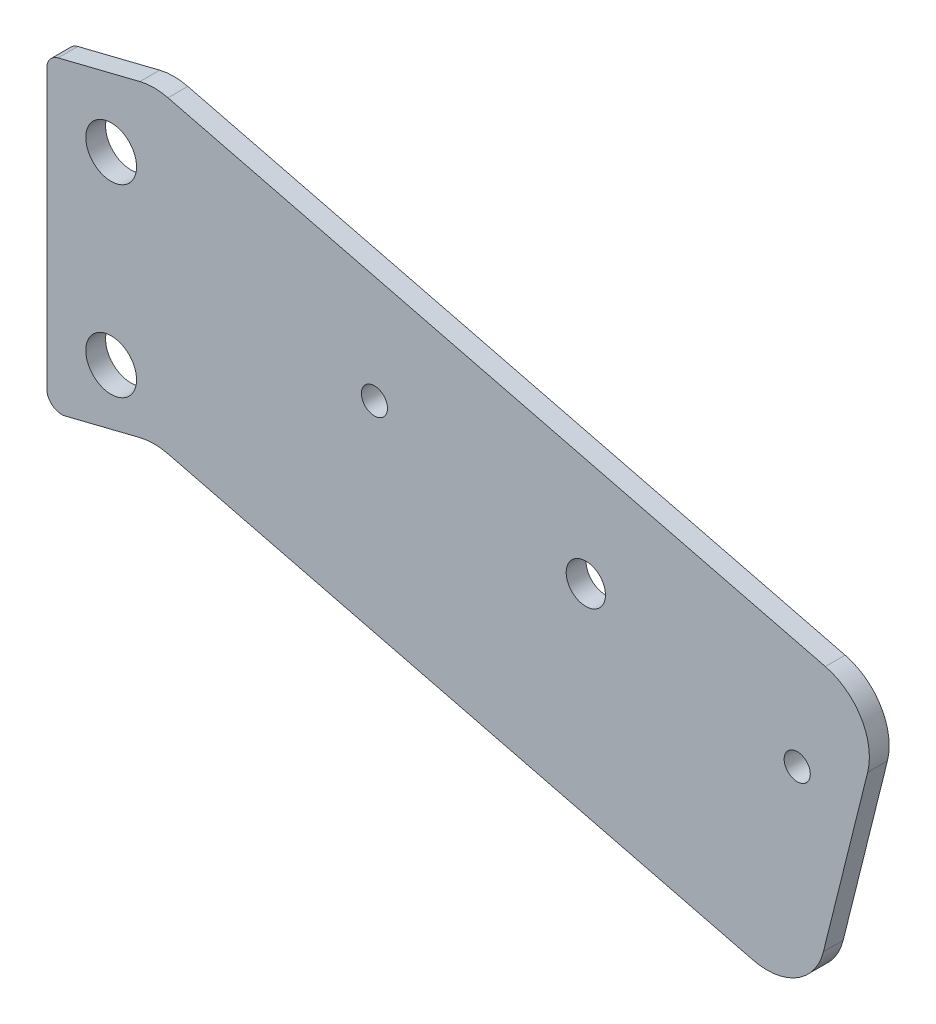
ISO-10303-21;
HEADER;
FILE_DESCRIPTION(('STEP AP214'),'2;1');
FILE_NAME('part.step','',(''),(''),'','','');
FILE_SCHEMA(('AUTOMOTIVE_DESIGN { 1 0 10303 214 1 1 1 1 }'));
ENDSEC;
DATA;
#1=APPLICATION_CONTEXT('core data for automotive mechanical design processes');
#2=APPLICATION_PROTOCOL_DEFINITION('international standard','automotive_design',2000,#1);
#3=PRODUCT_CONTEXT('',#1,'mechanical');
#4=PRODUCT('Part','Part','',(#3));
#5=PRODUCT_RELATED_PRODUCT_CATEGORY('part','',(#4));
#6=PRODUCT_DEFINITION_FORMATION('','',#4);
#7=PRODUCT_DEFINITION_CONTEXT('part definition',#1,'design');
#8=PRODUCT_DEFINITION('design','',#6,#7);
#9=PRODUCT_DEFINITION_SHAPE('','',#8);
#10=(LENGTH_UNIT() NAMED_UNIT(*) SI_UNIT(.MILLI.,.METRE.));
#11=(NAMED_UNIT(*) PLANE_ANGLE_UNIT() SI_UNIT($,.RADIAN.));
#12=(NAMED_UNIT(*) SI_UNIT($,.STERADIAN.) SOLID_ANGLE_UNIT());
#13=UNCERTAINTY_MEASURE_WITH_UNIT(LENGTH_MEASURE(1.E-05),#10,'distance_accuracy_value','');
#14=(GEOMETRIC_REPRESENTATION_CONTEXT(3) GLOBAL_UNCERTAINTY_ASSIGNED_CONTEXT((#13)) GLOBAL_UNIT_ASSIGNED_CONTEXT((#10,
#11,#12)) REPRESENTATION_CONTEXT('',''));
#15=CARTESIAN_POINT('',(0.,0.,0.));
#16=DIRECTION('',(0.,0.,1.));
#17=DIRECTION('',(1.,0.,0.));
#18=AXIS2_PLACEMENT_3D('',#15,#16,#17);
#19=CARTESIAN_POINT('',(-15.8988013968134,-70.6550243550996,-3.4036));
#20=DIRECTION('',(0.,0.,1.));
#21=DIRECTION('',(1.,0.,0.));
#22=AXIS2_PLACEMENT_3D('',#19,#20,#21);
#23=CYLINDRICAL_SURFACE('',#22,2.54);
#24=CARTESIAN_POINT('',(-15.8988013968134,-70.6550243550996,0.));
#25=DIRECTION('',(0.,0.,1.));
#26=DIRECTION('',(-1.,0.,0.));
#27=AXIS2_PLACEMENT_3D('',#24,#25,#26);
#28=CIRCLE('',#27,2.54);
#29=CARTESIAN_POINT('',(-18.4388013968133,-70.6550243550996,0.));
#30=VERTEX_POINT('',#29);
#31=CARTESIAN_POINT('',(-15.2843197819902,-73.1195754998407,0.));
#32=VERTEX_POINT('',#31);
#33=EDGE_CURVE('E159',#30,#32,#28,.T.);
#34=ORIENTED_EDGE('',*,*,#33,.F.);
#35=DIRECTION('',(0.,0.,1.));
#36=VECTOR('',#35,1.);
#37=CARTESIAN_POINT('',(-18.4388013968133,-70.6550243550996,-3.4036));
#38=LINE('',#37,#36);
#39=CARTESIAN_POINT('',(-18.4388013968133,-70.6550243550996,-3.4036));
#40=VERTEX_POINT('',#39);
#41=EDGE_CURVE('E11',#40,#30,#38,.T.);
#42=ORIENTED_EDGE('',*,*,#41,.F.);
#43=CARTESIAN_POINT('',(-15.8988013968134,-70.6550243550996,-3.4036));
#44=DIRECTION('',(0.,0.,1.));
#45=DIRECTION('',(-1.,0.,0.));
#46=AXIS2_PLACEMENT_3D('',#43,#44,#45);
#47=CIRCLE('',#46,2.54);
#48=CARTESIAN_POINT('',(-15.2843197819902,-73.1195754998407,-3.4036));
#49=VERTEX_POINT('',#48);
#50=EDGE_CURVE('E192',#40,#49,#47,.T.);
#51=ORIENTED_EDGE('',*,*,#50,.T.);
#52=DIRECTION('',(0.,0.,1.));
#53=VECTOR('',#52,1.);
#54=CARTESIAN_POINT('',(-15.2843197819902,-73.1195754998407,-3.4036));
#55=LINE('',#54,#53);
#56=EDGE_CURVE('E41',#49,#32,#55,.T.);
#57=ORIENTED_EDGE('',*,*,#56,.T.);
#58=EDGE_LOOP('',(#34,#42,#51,#57));
#59=FACE_BOUND('',#58,.T.);
#60=ADVANCED_FACE('F38',(#59),#23,.T.);
#61=CARTESIAN_POINT('',(-18.4388013968134,-22.8139396806774,-3.4036));
#62=DIRECTION('',(-1.,0.,0.));
#63=DIRECTION('',(0.,-1.,0.));
#64=AXIS2_PLACEMENT_3D('',#61,#62,#63);
#65=PLANE('',#64);
#66=DIRECTION('',(0.,-1.,0.));
#67=VECTOR('',#66,1.);
#68=CARTESIAN_POINT('',(-18.4388013968134,-22.8139396806774,0.));
#69=LINE('',#68,#67);
#70=CARTESIAN_POINT('',(-18.4388013968134,-22.8139396806774,0.));
#71=VERTEX_POINT('',#70);
#72=EDGE_CURVE('E190',#71,#30,#69,.T.);
#73=ORIENTED_EDGE('',*,*,#72,.F.);
#74=DIRECTION('',(0.,0.,1.));
#75=VECTOR('',#74,1.);
#76=CARTESIAN_POINT('',(-18.4388013968134,-22.8139396806774,-3.4036));
#77=LINE('',#76,#75);
#78=CARTESIAN_POINT('',(-18.4388013968134,-22.8139396806774,-3.4036));
#79=VERTEX_POINT('',#78);
#80=EDGE_CURVE('E47',#79,#71,#77,.T.);
#81=ORIENTED_EDGE('',*,*,#80,.F.);
#82=DIRECTION('',(0.,-1.,0.));
#83=VECTOR('',#82,1.);
#84=CARTESIAN_POINT('',(-18.4388013968134,-22.8139396806774,-3.4036));
#85=LINE('',#84,#83);
#86=EDGE_CURVE('E149',#79,#40,#85,.T.);
#87=ORIENTED_EDGE('',*,*,#86,.T.);
#88=ORIENTED_EDGE('',*,*,#41,.T.);
#89=EDGE_LOOP('',(#73,#81,#87,#88));
#90=FACE_BOUND('',#89,.T.);
#91=ADVANCED_FACE('F212',(#90),#65,.T.);
#92=CARTESIAN_POINT('',(-15.8988013968134,-22.8139396806774,-3.4036));
#93=DIRECTION('',(0.,0.,1.));
#94=DIRECTION('',(1.,0.,0.));
#95=AXIS2_PLACEMENT_3D('',#92,#93,#94);
#96=CYLINDRICAL_SURFACE('',#95,2.54);
#97=CARTESIAN_POINT('',(-15.8988013968134,-22.8139396806774,0.));
#98=DIRECTION('',(0.,0.,1.));
#99=DIRECTION('',(1.,0.,0.));
#100=AXIS2_PLACEMENT_3D('',#97,#98,#99);
#101=CIRCLE('',#100,2.54);
#102=CARTESIAN_POINT('',(-16.5132830116365,-20.3493885359364,0.));
#103=VERTEX_POINT('',#102);
#104=EDGE_CURVE('E136',#103,#71,#101,.T.);
#105=ORIENTED_EDGE('',*,*,#104,.F.);
#106=DIRECTION('',(0.,0.,1.));
#107=VECTOR('',#106,1.);
#108=CARTESIAN_POINT('',(-16.5132830116365,-20.3493885359364,-3.4036));
#109=LINE('',#108,#107);
#110=CARTESIAN_POINT('',(-16.5132830116365,-20.3493885359364,-3.4036));
#111=VERTEX_POINT('',#110);
#112=EDGE_CURVE('E131',#111,#103,#109,.T.);
#113=ORIENTED_EDGE('',*,*,#112,.F.);
#114=CARTESIAN_POINT('',(-15.8988013968134,-22.8139396806774,-3.4036));
#115=DIRECTION('',(0.,0.,1.));
#116=DIRECTION('',(1.,0.,0.));
#117=AXIS2_PLACEMENT_3D('',#114,#115,#116);
#118=CIRCLE('',#117,2.54);
#119=EDGE_CURVE('E134',#111,#79,#118,.T.);
#120=ORIENTED_EDGE('',*,*,#119,.T.);
#121=ORIENTED_EDGE('',*,*,#80,.T.);
#122=EDGE_LOOP('',(#105,#113,#120,#121));
#123=FACE_BOUND('',#122,.T.);
#124=ADVANCED_FACE('F133',(#123),#96,.T.);
#125=CARTESIAN_POINT('',(-16.5132830116365,-20.3493885359364,-3.4036));
#126=DIRECTION('',(-0.241921895599666,0.970295726275997,0.));
#127=DIRECTION('',(-0.970295726275997,-0.241921895599666,0.));
#128=AXIS2_PLACEMENT_3D('',#125,#126,#127);
#129=PLANE('',#128);
#130=DIRECTION('',(-0.970295726275997,-0.241921895599666,0.));
#131=VECTOR('',#130,1.);
#132=CARTESIAN_POINT('',(-16.5132830116365,-20.3493885359364,0.));
#133=LINE('',#132,#131);
#134=CARTESIAN_POINT('',(-2.41921895599664,-16.8353436929998,0.));
#135=VERTEX_POINT('',#134);
#136=EDGE_CURVE('E187',#135,#103,#133,.T.);
#137=ORIENTED_EDGE('',*,*,#136,.F.);
#138=DIRECTION('',(0.,0.,1.));
#139=VECTOR('',#138,1.);
#140=CARTESIAN_POINT('',(-2.41921895599664,-16.8353436929998,-3.4036));
#141=LINE('',#140,#139);
#142=CARTESIAN_POINT('',(-2.41921895599664,-16.8353436929998,-3.4036));
#143=VERTEX_POINT('',#142);
#144=EDGE_CURVE('E141',#143,#135,#141,.T.);
#145=ORIENTED_EDGE('',*,*,#144,.F.);
#146=DIRECTION('',(-0.970295726275997,-0.241921895599666,0.));
#147=VECTOR('',#146,1.);
#148=CARTESIAN_POINT('',(-16.5132830116365,-20.3493885359364,-3.4036));
#149=LINE('',#148,#147);
#150=EDGE_CURVE('E147',#143,#111,#149,.T.);
#151=ORIENTED_EDGE('',*,*,#150,.T.);
#152=ORIENTED_EDGE('',*,*,#112,.T.);
#153=EDGE_LOOP('',(#137,#145,#151,#152));
#154=FACE_BOUND('',#153,.T.);
#155=ADVANCED_FACE('F151',(#154),#129,.T.);
#156=CARTESIAN_POINT('',(0.,-26.5383009557598,-3.4036));
#157=DIRECTION('',(0.,0.,1.));
#158=DIRECTION('',(1.,0.,0.));
#159=AXIS2_PLACEMENT_3D('',#156,#157,#158);
#160=CYLINDRICAL_SURFACE('',#159,10.);
#161=CARTESIAN_POINT('',(0.,-26.5383009557598,0.));
#162=DIRECTION('',(0.,0.,1.));
#163=DIRECTION('',(-1.,0.,0.));
#164=AXIS2_PLACEMENT_3D('',#161,#162,#163);
#165=CIRCLE('',#164,10.);
#166=CARTESIAN_POINT('',(2.41921895599665,-16.8353436929998,0.));
#167=VERTEX_POINT('',#166);
#168=EDGE_CURVE('E184',#167,#135,#165,.T.);
#169=ORIENTED_EDGE('',*,*,#168,.F.);
#170=DIRECTION('',(0.,0.,1.));
#171=VECTOR('',#170,1.);
#172=CARTESIAN_POINT('',(2.41921895599665,-16.8353436929998,-3.4036));
#173=LINE('',#172,#171);
#174=CARTESIAN_POINT('',(2.41921895599665,-16.8353436929998,-3.4036));
#175=VERTEX_POINT('',#174);
#176=EDGE_CURVE('E196',#175,#167,#173,.T.);
#177=ORIENTED_EDGE('',*,*,#176,.F.);
#178=CARTESIAN_POINT('',(0.,-26.5383009557598,-3.4036));
#179=DIRECTION('',(0.,0.,1.));
#180=DIRECTION('',(-1.,0.,0.));
#181=AXIS2_PLACEMENT_3D('',#178,#179,#180);
#182=CIRCLE('',#181,10.);
#183=EDGE_CURVE('E152',#175,#143,#182,.T.);
#184=ORIENTED_EDGE('',*,*,#183,.T.);
#185=ORIENTED_EDGE('',*,*,#144,.T.);
#186=EDGE_LOOP('',(#169,#177,#184,#185));
#187=FACE_BOUND('',#186,.T.);
#188=ADVANCED_FACE('F225',(#187),#160,.T.);
#189=CARTESIAN_POINT('',(2.41921895599665,-16.8353436929998,-3.4036));
#190=DIRECTION('',(0.241921895599665,0.970295726275997,0.));
#191=DIRECTION('',(-0.970295726275997,0.241921895599665,0.));
#192=AXIS2_PLACEMENT_3D('',#189,#190,#191);
#193=PLANE('',#192);
#194=DIRECTION('',(-0.970295726275997,0.241921895599665,0.));
#195=VECTOR('',#194,1.);
#196=CARTESIAN_POINT('',(2.41921895599665,-16.8353436929998,0.));
#197=LINE('',#196,#195);
#198=CARTESIAN_POINT('',(115.560967742793,-45.0447499561963,0.));
#199=VERTEX_POINT('',#198);
#200=EDGE_CURVE('E181',#199,#167,#197,.T.);
#201=ORIENTED_EDGE('',*,*,#200,.F.);
#202=DIRECTION('',(0.,0.,1.));
#203=VECTOR('',#202,1.);
#204=CARTESIAN_POINT('',(115.560967742793,-45.0447499561963,-3.4036));
#205=LINE('',#204,#203);
#206=CARTESIAN_POINT('',(115.560967742793,-45.0447499561963,-3.4036));
#207=VERTEX_POINT('',#206);
#208=EDGE_CURVE('E198',#207,#199,#205,.T.);
#209=ORIENTED_EDGE('',*,*,#208,.F.);
#210=DIRECTION('',(-0.970295726275997,0.241921895599665,0.));
#211=VECTOR('',#210,1.);
#212=CARTESIAN_POINT('',(2.41921895599665,-16.8353436929998,-3.4036));
#213=LINE('',#212,#211);
#214=EDGE_CURVE('E154',#207,#175,#213,.T.);
#215=ORIENTED_EDGE('',*,*,#214,.T.);
#216=ORIENTED_EDGE('',*,*,#176,.T.);
#217=EDGE_LOOP('',(#201,#209,#215,#216));
#218=FACE_BOUND('',#217,.T.);
#219=ADVANCED_FACE('F228',(#218),#193,.T.);
#220=CARTESIAN_POINT('',(113.141748786796,-54.7477072189563,-3.4036));
#221=DIRECTION('',(0.,0.,1.));
#222=DIRECTION('',(1.,0.,0.));
#223=AXIS2_PLACEMENT_3D('',#220,#221,#222);
#224=CYLINDRICAL_SURFACE('',#223,10.);
#225=CARTESIAN_POINT('',(113.141748786796,-54.7477072189563,0.));
#226=DIRECTION('',(0.,0.,1.));
#227=DIRECTION('',(-1.,0.,0.));
#228=AXIS2_PLACEMENT_3D('',#225,#226,#227);
#229=CIRCLE('',#228,10.);
#230=CARTESIAN_POINT('',(122.844706049556,-57.1669261749529,0.));
#231=VERTEX_POINT('',#230);
#232=EDGE_CURVE('E178',#231,#199,#229,.T.);
#233=ORIENTED_EDGE('',*,*,#232,.F.);
#234=DIRECTION('',(0.,0.,1.));
#235=VECTOR('',#234,1.);
#236=CARTESIAN_POINT('',(122.844706049556,-57.1669261749529,-3.4036));
#237=LINE('',#236,#235);
#238=CARTESIAN_POINT('',(122.844706049556,-57.1669261749529,-3.4036));
#239=VERTEX_POINT('',#238);
#240=EDGE_CURVE('E200',#239,#231,#237,.T.);
#241=ORIENTED_EDGE('',*,*,#240,.F.);
#242=CARTESIAN_POINT('',(113.141748786796,-54.7477072189563,-3.4036));
#243=DIRECTION('',(0.,0.,1.));
#244=DIRECTION('',(-1.,0.,0.));
#245=AXIS2_PLACEMENT_3D('',#242,#243,#244);
#246=CIRCLE('',#245,10.);
#247=EDGE_CURVE('E332',#239,#207,#246,.T.);
#248=ORIENTED_EDGE('',*,*,#247,.T.);
#249=ORIENTED_EDGE('',*,*,#208,.T.);
#250=EDGE_LOOP('',(#233,#241,#248,#249));
#251=FACE_BOUND('',#250,.T.);
#252=ADVANCED_FACE('F232',(#251),#224,.T.);
#253=CARTESIAN_POINT('',(122.844706049556,-57.1669261749529,-3.4036));
#254=DIRECTION('',(0.970295726275997,-0.241921895599664,0.));
#255=DIRECTION('',(0.241921895599664,0.970295726275997,0.));
#256=AXIS2_PLACEMENT_3D('',#253,#254,#255);
#257=PLANE('',#256);
#258=DIRECTION('',(0.241921895599664,0.970295726275997,0.));
#259=VECTOR('',#258,1.);
#260=CARTESIAN_POINT('',(122.844706049556,-57.1669261749529,0.));
#261=LINE('',#260,#259);
#262=CARTESIAN_POINT('',(115.224166338167,-87.7312415526469,0.));
#263=VERTEX_POINT('',#262);
#264=EDGE_CURVE('E175',#263,#231,#261,.T.);
#265=ORIENTED_EDGE('',*,*,#264,.F.);
#266=DIRECTION('',(0.,0.,1.));
#267=VECTOR('',#266,1.);
#268=CARTESIAN_POINT('',(115.224166338167,-87.7312415526469,-3.4036));
#269=LINE('',#268,#267);
#270=CARTESIAN_POINT('',(115.224166338167,-87.7312415526469,-3.4036));
#271=VERTEX_POINT('',#270);
#272=EDGE_CURVE('E202',#271,#263,#269,.T.);
#273=ORIENTED_EDGE('',*,*,#272,.F.);
#274=DIRECTION('',(0.241921895599664,0.970295726275997,0.));
#275=VECTOR('',#274,1.);
#276=CARTESIAN_POINT('',(122.844706049556,-57.1669261749529,-3.4036));
#277=LINE('',#276,#275);
#278=EDGE_CURVE('E329',#271,#239,#277,.T.);
#279=ORIENTED_EDGE('',*,*,#278,.T.);
#280=ORIENTED_EDGE('',*,*,#240,.T.);
#281=EDGE_LOOP('',(#265,#273,#279,#280));
#282=FACE_BOUND('',#281,.T.);
#283=ADVANCED_FACE('F236',(#282),#257,.T.);
#284=CARTESIAN_POINT('',(105.521209075407,-85.3120225966502,-3.4036));
#285=DIRECTION('',(0.,0.,1.));
#286=DIRECTION('',(1.,0.,0.));
#287=AXIS2_PLACEMENT_3D('',#284,#285,#286);
#288=CYLINDRICAL_SURFACE('',#287,10.);
#289=CARTESIAN_POINT('',(105.521209075407,-85.3120225966502,0.));
#290=DIRECTION('',(0.,0.,1.));
#291=DIRECTION('',(-1.,0.,0.));
#292=AXIS2_PLACEMENT_3D('',#289,#290,#291);
#293=CIRCLE('',#292,10.);
#294=CARTESIAN_POINT('',(103.10199011941,-95.0149798594102,0.));
#295=VERTEX_POINT('',#294);
#296=EDGE_CURVE('E172',#295,#263,#293,.T.);
#297=ORIENTED_EDGE('',*,*,#296,.F.);
#298=DIRECTION('',(0.,0.,1.));
#299=VECTOR('',#298,1.);
#300=CARTESIAN_POINT('',(103.10199011941,-95.0149798594102,-3.4036));
#301=LINE('',#300,#299);
#302=CARTESIAN_POINT('',(103.10199011941,-95.0149798594102,-3.4036));
#303=VERTEX_POINT('',#302);
#304=EDGE_CURVE('E204',#303,#295,#301,.T.);
#305=ORIENTED_EDGE('',*,*,#304,.F.);
#306=CARTESIAN_POINT('',(105.521209075407,-85.3120225966502,-3.4036));
#307=DIRECTION('',(0.,0.,1.));
#308=DIRECTION('',(-1.,0.,0.));
#309=AXIS2_PLACEMENT_3D('',#306,#307,#308);
#310=CIRCLE('',#309,10.);
#311=EDGE_CURVE('E326',#303,#271,#310,.T.);
#312=ORIENTED_EDGE('',*,*,#311,.T.);
#313=ORIENTED_EDGE('',*,*,#272,.T.);
#314=EDGE_LOOP('',(#297,#305,#312,#313));
#315=FACE_BOUND('',#314,.T.);
#316=ADVANCED_FACE('F240',(#315),#288,.T.);
#317=CARTESIAN_POINT('',(103.10199011941,-95.0149798594102,-3.4036));
#318=DIRECTION('',(-0.241921895599665,-0.970295726275997,0.));
#319=DIRECTION('',(0.970295726275997,-0.241921895599665,0.));
#320=AXIS2_PLACEMENT_3D('',#317,#318,#319);
#321=PLANE('',#320);
#322=DIRECTION('',(0.970295726275997,-0.241921895599665,0.));
#323=VECTOR('',#322,1.);
#324=CARTESIAN_POINT('',(103.10199011941,-95.0149798594102,0.));
#325=LINE('',#324,#323);
#326=CARTESIAN_POINT('',(2.41921895599664,-69.9119456045196,0.));
#327=VERTEX_POINT('',#326);
#328=EDGE_CURVE('E169',#327,#295,#325,.T.);
#329=ORIENTED_EDGE('',*,*,#328,.F.);
#330=DIRECTION('',(0.,0.,1.));
#331=VECTOR('',#330,1.);
#332=CARTESIAN_POINT('',(2.41921895599664,-69.9119456045196,-3.4036));
#333=LINE('',#332,#331);
#334=CARTESIAN_POINT('',(2.41921895599664,-69.9119456045196,-3.4036));
#335=VERTEX_POINT('',#334);
#336=EDGE_CURVE('E206',#335,#327,#333,.T.);
#337=ORIENTED_EDGE('',*,*,#336,.F.);
#338=DIRECTION('',(0.970295726275997,-0.241921895599665,0.));
#339=VECTOR('',#338,1.);
#340=CARTESIAN_POINT('',(103.10199011941,-95.0149798594102,-3.4036));
#341=LINE('',#340,#339);
#342=EDGE_CURVE('E323',#335,#303,#341,.T.);
#343=ORIENTED_EDGE('',*,*,#342,.T.);
#344=ORIENTED_EDGE('',*,*,#304,.T.);
#345=EDGE_LOOP('',(#329,#337,#343,#344));
#346=FACE_BOUND('',#345,.T.);
#347=ADVANCED_FACE('F244',(#346),#321,.T.);
#348=CARTESIAN_POINT('',(0.,-79.6149028672795,-3.4036));
#349=DIRECTION('',(0.,0.,1.));
#350=DIRECTION('',(1.,0.,0.));
#351=AXIS2_PLACEMENT_3D('',#348,#349,#350);
#352=CYLINDRICAL_SURFACE('',#351,10.);
#353=CARTESIAN_POINT('',(0.,-79.6149028672795,0.));
#354=DIRECTION('',(0.,0.,-1.));
#355=DIRECTION('',(1.,0.,0.));
#356=AXIS2_PLACEMENT_3D('',#353,#354,#355);
#357=CIRCLE('',#356,10.);
#358=CARTESIAN_POINT('',(-2.41921895599665,-69.9119456045196,0.));
#359=VERTEX_POINT('',#358);
#360=EDGE_CURVE('E166',#359,#327,#357,.T.);
#361=ORIENTED_EDGE('',*,*,#360,.F.);
#362=DIRECTION('',(0.,0.,1.));
#363=VECTOR('',#362,1.);
#364=CARTESIAN_POINT('',(-2.41921895599665,-69.9119456045196,-3.4036));
#365=LINE('',#364,#363);
#366=CARTESIAN_POINT('',(-2.41921895599665,-69.9119456045196,-3.4036));
#367=VERTEX_POINT('',#366);
#368=EDGE_CURVE('E207',#367,#359,#365,.T.);
#369=ORIENTED_EDGE('',*,*,#368,.F.);
#370=CARTESIAN_POINT('',(0.,-79.6149028672795,-3.4036));
#371=DIRECTION('',(0.,0.,-1.));
#372=DIRECTION('',(1.,0.,0.));
#373=AXIS2_PLACEMENT_3D('',#370,#371,#372);
#374=CIRCLE('',#373,10.);
#375=EDGE_CURVE('E320',#367,#335,#374,.T.);
#376=ORIENTED_EDGE('',*,*,#375,.T.);
#377=ORIENTED_EDGE('',*,*,#336,.T.);
#378=EDGE_LOOP('',(#361,#369,#376,#377));
#379=FACE_BOUND('',#378,.T.);
#380=ADVANCED_FACE('F248',(#379),#352,.F.);
#381=CARTESIAN_POINT('',(-2.41921895599665,-69.9119456045196,-3.4036));
#382=DIRECTION('',(0.241921895599665,-0.970295726275997,0.));
#383=DIRECTION('',(0.970295726275997,0.241921895599665,0.));
#384=AXIS2_PLACEMENT_3D('',#381,#382,#383);
#385=PLANE('',#384);
#386=DIRECTION('',(0.970295726275997,0.241921895599665,0.));
#387=VECTOR('',#386,1.);
#388=CARTESIAN_POINT('',(-2.41921895599665,-69.9119456045196,0.));
#389=LINE('',#388,#387);
#390=EDGE_CURVE('E162',#32,#359,#389,.T.);
#391=ORIENTED_EDGE('',*,*,#390,.F.);
#392=ORIENTED_EDGE('',*,*,#56,.F.);
#393=DIRECTION('',(0.970295726275997,0.241921895599665,0.));
#394=VECTOR('',#393,1.);
#395=CARTESIAN_POINT('',(-2.41921895599665,-69.9119456045196,-3.4036));
#396=LINE('',#395,#394);
#397=EDGE_CURVE('E318',#49,#367,#396,.T.);
#398=ORIENTED_EDGE('',*,*,#397,.T.);
#399=ORIENTED_EDGE('',*,*,#368,.T.);
#400=EDGE_LOOP('',(#391,#392,#398,#399));
#401=FACE_BOUND('',#400,.T.);
#402=ADVANCED_FACE('F209',(#401),#385,.T.);
#403=CARTESIAN_POINT('',(-15.8988013968134,-70.6550243550996,-3.4036));
#404=DIRECTION('',(0.,0.,-1.));
#405=DIRECTION('',(-1.,0.,0.));
#406=AXIS2_PLACEMENT_3D('',#403,#404,#405);
#407=PLANE('',#406);
#408=CARTESIAN_POINT('',(-7.36599999999999,-61.5695602345621,-3.4036));
#409=DIRECTION('',(0.,0.,1.));
#410=DIRECTION('',(1.,0.,0.));
#411=AXIS2_PLACEMENT_3D('',#408,#409,#410);
#412=CIRCLE('',#411,4.3688);
#413=CARTESIAN_POINT('',(-2.99719999999999,-61.5695602345621,-3.4036));
#414=VERTEX_POINT('',#413);
#415=EDGE_CURVE('E287',#414,#414,#412,.T.);
#416=ORIENTED_EDGE('',*,*,#415,.T.);
#417=EDGE_LOOP('',(#416));
#418=FACE_BOUND('',#417,.T.);
#419=CARTESIAN_POINT('',(-7.366,-29.8195602345622,-3.4036));
#420=DIRECTION('',(0.,0.,1.));
#421=DIRECTION('',(1.,0.,0.));
#422=AXIS2_PLACEMENT_3D('',#419,#420,#421);
#423=CIRCLE('',#422,4.3688);
#424=CARTESIAN_POINT('',(-2.9972,-29.8195602345622,-3.4036));
#425=VERTEX_POINT('',#424);
#426=EDGE_CURVE('E297',#425,#425,#423,.T.);
#427=ORIENTED_EDGE('',*,*,#426,.T.);
#428=EDGE_LOOP('',(#427));
#429=FACE_BOUND('',#428,.T.);
#430=CARTESIAN_POINT('',(37.9490462881613,-44.2449699113896,-3.4036));
#431=DIRECTION('',(0.,0.,1.));
#432=DIRECTION('',(1.,0.,0.));
#433=AXIS2_PLACEMENT_3D('',#430,#431,#432);
#434=CIRCLE('',#433,2.25);
#435=CARTESIAN_POINT('',(40.1990462881613,-44.2449699113896,-3.4036));
#436=VERTEX_POINT('',#435);
#437=EDGE_CURVE('E303',#436,#436,#434,.T.);
#438=ORIENTED_EDGE('',*,*,#437,.T.);
#439=EDGE_LOOP('',(#438));
#440=FACE_BOUND('',#439,.T.);
#441=CARTESIAN_POINT('',(110.721225758861,-62.3891120813644,-3.4036));
#442=DIRECTION('',(0.,0.,1.));
#443=DIRECTION('',(1.,0.,0.));
#444=AXIS2_PLACEMENT_3D('',#441,#442,#443);
#445=CIRCLE('',#444,2.25);
#446=CARTESIAN_POINT('',(112.971225758861,-62.3891120813644,-3.4036));
#447=VERTEX_POINT('',#446);
#448=EDGE_CURVE('E309',#447,#447,#445,.T.);
#449=ORIENTED_EDGE('',*,*,#448,.T.);
#450=EDGE_LOOP('',(#449));
#451=FACE_BOUND('',#450,.T.);
#452=CARTESIAN_POINT('',(74.3351360235112,-53.317040996377,-3.4036));
#453=DIRECTION('',(0.,0.,1.));
#454=DIRECTION('',(1.,0.,0.));
#455=AXIS2_PLACEMENT_3D('',#452,#453,#454);
#456=CIRCLE('',#455,3.3782);
#457=CARTESIAN_POINT('',(77.7133360235112,-53.317040996377,-3.4036));
#458=VERTEX_POINT('',#457);
#459=EDGE_CURVE('E163',#458,#458,#456,.T.);
#460=ORIENTED_EDGE('',*,*,#459,.T.);
#461=EDGE_LOOP('',(#460));
#462=FACE_BOUND('',#461,.T.);
#463=ORIENTED_EDGE('',*,*,#50,.F.);
#464=ORIENTED_EDGE('',*,*,#86,.F.);
#465=ORIENTED_EDGE('',*,*,#119,.F.);
#466=ORIENTED_EDGE('',*,*,#150,.F.);
#467=ORIENTED_EDGE('',*,*,#183,.F.);
#468=ORIENTED_EDGE('',*,*,#214,.F.);
#469=ORIENTED_EDGE('',*,*,#247,.F.);
#470=ORIENTED_EDGE('',*,*,#278,.F.);
#471=ORIENTED_EDGE('',*,*,#311,.F.);
#472=ORIENTED_EDGE('',*,*,#342,.F.);
#473=ORIENTED_EDGE('',*,*,#375,.F.);
#474=ORIENTED_EDGE('',*,*,#397,.F.);
#475=EDGE_LOOP('',(#463,#464,#465,#466,#467,#468,#469,#470,#471,#472,#473,#474));
#476=FACE_BOUND('',#475,.T.);
#477=ADVANCED_FACE('F145',(#418,#429,#440,#451,#462,#476),#407,.T.);
#478=CARTESIAN_POINT('',(-15.8988013968134,-70.6550243550996,0.));
#479=DIRECTION('',(0.,0.,-1.));
#480=DIRECTION('',(-1.,0.,0.));
#481=AXIS2_PLACEMENT_3D('',#478,#479,#480);
#482=PLANE('',#481);
#483=CARTESIAN_POINT('',(-7.36599999999999,-61.5695602345621,0.));
#484=DIRECTION('',(0.,0.,1.));
#485=DIRECTION('',(1.,0.,0.));
#486=AXIS2_PLACEMENT_3D('',#483,#484,#485);
#487=CIRCLE('',#486,4.3688);
#488=CARTESIAN_POINT('',(-2.99719999999999,-61.5695602345621,0.));
#489=VERTEX_POINT('',#488);
#490=EDGE_CURVE('E290',#489,#489,#487,.T.);
#491=ORIENTED_EDGE('',*,*,#490,.F.);
#492=EDGE_LOOP('',(#491));
#493=FACE_BOUND('',#492,.T.);
#494=CARTESIAN_POINT('',(-7.366,-29.8195602345622,0.));
#495=DIRECTION('',(0.,0.,1.));
#496=DIRECTION('',(1.,0.,0.));
#497=AXIS2_PLACEMENT_3D('',#494,#495,#496);
#498=CIRCLE('',#497,4.3688);
#499=CARTESIAN_POINT('',(-2.9972,-29.8195602345622,0.));
#500=VERTEX_POINT('',#499);
#501=EDGE_CURVE('E292',#500,#500,#498,.T.);
#502=ORIENTED_EDGE('',*,*,#501,.F.);
#503=EDGE_LOOP('',(#502));
#504=FACE_BOUND('',#503,.T.);
#505=CARTESIAN_POINT('',(37.9490462881613,-44.2449699113896,0.));
#506=DIRECTION('',(0.,0.,1.));
#507=DIRECTION('',(1.,0.,0.));
#508=AXIS2_PLACEMENT_3D('',#505,#506,#507);
#509=CIRCLE('',#508,2.25);
#510=CARTESIAN_POINT('',(40.1990462881613,-44.2449699113896,0.));
#511=VERTEX_POINT('',#510);
#512=EDGE_CURVE('E300',#511,#511,#509,.T.);
#513=ORIENTED_EDGE('',*,*,#512,.F.);
#514=EDGE_LOOP('',(#513));
#515=FACE_BOUND('',#514,.T.);
#516=CARTESIAN_POINT('',(110.721225758861,-62.3891120813644,0.));
#517=DIRECTION('',(0.,0.,1.));
#518=DIRECTION('',(1.,0.,0.));
#519=AXIS2_PLACEMENT_3D('',#516,#517,#518);
#520=CIRCLE('',#519,2.25);
#521=CARTESIAN_POINT('',(112.971225758861,-62.3891120813644,0.));
#522=VERTEX_POINT('',#521);
#523=EDGE_CURVE('E306',#522,#522,#520,.T.);
#524=ORIENTED_EDGE('',*,*,#523,.F.);
#525=EDGE_LOOP('',(#524));
#526=FACE_BOUND('',#525,.T.);
#527=CARTESIAN_POINT('',(74.3351360235112,-53.317040996377,0.));
#528=DIRECTION('',(0.,0.,1.));
#529=DIRECTION('',(1.,0.,0.));
#530=AXIS2_PLACEMENT_3D('',#527,#528,#529);
#531=CIRCLE('',#530,3.3782);
#532=CARTESIAN_POINT('',(77.7133360235112,-53.317040996377,0.));
#533=VERTEX_POINT('',#532);
#534=EDGE_CURVE('E312',#533,#533,#531,.T.);
#535=ORIENTED_EDGE('',*,*,#534,.F.);
#536=EDGE_LOOP('',(#535));
#537=FACE_BOUND('',#536,.T.);
#538=ORIENTED_EDGE('',*,*,#33,.T.);
#539=ORIENTED_EDGE('',*,*,#390,.T.);
#540=ORIENTED_EDGE('',*,*,#360,.T.);
#541=ORIENTED_EDGE('',*,*,#328,.T.);
#542=ORIENTED_EDGE('',*,*,#296,.T.);
#543=ORIENTED_EDGE('',*,*,#264,.T.);
#544=ORIENTED_EDGE('',*,*,#232,.T.);
#545=ORIENTED_EDGE('',*,*,#200,.T.);
#546=ORIENTED_EDGE('',*,*,#168,.T.);
#547=ORIENTED_EDGE('',*,*,#136,.T.);
#548=ORIENTED_EDGE('',*,*,#104,.T.);
#549=ORIENTED_EDGE('',*,*,#72,.T.);
#550=EDGE_LOOP('',(#538,#539,#540,#541,#542,#543,#544,#545,#546,#547,#548,#549));
#551=FACE_BOUND('',#550,.T.);
#552=ADVANCED_FACE('F211',(#493,#504,#515,#526,#537,#551),#482,.F.);
#553=CARTESIAN_POINT('',(74.3351360235112,-53.317040996377,0.));
#554=DIRECTION('',(0.,0.,1.));
#555=DIRECTION('',(1.,0.,0.));
#556=AXIS2_PLACEMENT_3D('',#553,#554,#555);
#557=CYLINDRICAL_SURFACE('',#556,3.3782);
#558=ORIENTED_EDGE('',*,*,#459,.F.);
#559=EDGE_LOOP('',(#558));
#560=FACE_BOUND('',#559,.T.);
#561=ORIENTED_EDGE('',*,*,#534,.T.);
#562=EDGE_LOOP('',(#561));
#563=FACE_BOUND('',#562,.T.);
#564=ADVANCED_FACE('F260',(#560,#563),#557,.F.);
#565=CARTESIAN_POINT('',(110.721225758861,-62.3891120813644,0.));
#566=DIRECTION('',(0.,0.,1.));
#567=DIRECTION('',(1.,0.,0.));
#568=AXIS2_PLACEMENT_3D('',#565,#566,#567);
#569=CYLINDRICAL_SURFACE('',#568,2.25);
#570=ORIENTED_EDGE('',*,*,#448,.F.);
#571=EDGE_LOOP('',(#570));
#572=FACE_BOUND('',#571,.T.);
#573=ORIENTED_EDGE('',*,*,#523,.T.);
#574=EDGE_LOOP('',(#573));
#575=FACE_BOUND('',#574,.T.);
#576=ADVANCED_FACE('F267',(#572,#575),#569,.F.);
#577=CARTESIAN_POINT('',(37.9490462881613,-44.2449699113896,0.));
#578=DIRECTION('',(0.,0.,1.));
#579=DIRECTION('',(1.,0.,0.));
#580=AXIS2_PLACEMENT_3D('',#577,#578,#579);
#581=CYLINDRICAL_SURFACE('',#580,2.25);
#582=ORIENTED_EDGE('',*,*,#437,.F.);
#583=EDGE_LOOP('',(#582));
#584=FACE_BOUND('',#583,.T.);
#585=ORIENTED_EDGE('',*,*,#512,.T.);
#586=EDGE_LOOP('',(#585));
#587=FACE_BOUND('',#586,.T.);
#588=ADVANCED_FACE('F271',(#584,#587),#581,.F.);
#589=CARTESIAN_POINT('',(-7.366,-29.8195602345622,0.));
#590=DIRECTION('',(0.,0.,1.));
#591=DIRECTION('',(1.,0.,0.));
#592=AXIS2_PLACEMENT_3D('',#589,#590,#591);
#593=CYLINDRICAL_SURFACE('',#592,4.3688);
#594=ORIENTED_EDGE('',*,*,#426,.F.);
#595=EDGE_LOOP('',(#594));
#596=FACE_BOUND('',#595,.T.);
#597=ORIENTED_EDGE('',*,*,#501,.T.);
#598=EDGE_LOOP('',(#597));
#599=FACE_BOUND('',#598,.T.);
#600=ADVANCED_FACE('F275',(#596,#599),#593,.F.);
#601=CARTESIAN_POINT('',(-7.36599999999999,-61.5695602345621,0.));
#602=DIRECTION('',(0.,0.,1.));
#603=DIRECTION('',(1.,0.,0.));
#604=AXIS2_PLACEMENT_3D('',#601,#602,#603);
#605=CYLINDRICAL_SURFACE('',#604,4.3688);
#606=ORIENTED_EDGE('',*,*,#415,.F.);
#607=EDGE_LOOP('',(#606));
#608=FACE_BOUND('',#607,.T.);
#609=ORIENTED_EDGE('',*,*,#490,.T.);
#610=EDGE_LOOP('',(#609));
#611=FACE_BOUND('',#610,.T.);
#612=ADVANCED_FACE('F279',(#608,#611),#605,.F.);
#613=CLOSED_SHELL('',(#60,#91,#124,#155,#188,#219,#252,#283,#316,#347,#380,#402,#477,#552,#564,
#576,#588,#600,#612));
#614=MANIFOLD_SOLID_BREP('B2',#613);
#615=ADVANCED_BREP_SHAPE_REPRESENTATION('',(#18,#614),#14);
#616=SHAPE_DEFINITION_REPRESENTATION(#9,#615);
ENDSEC;
END-ISO-10303-21;
